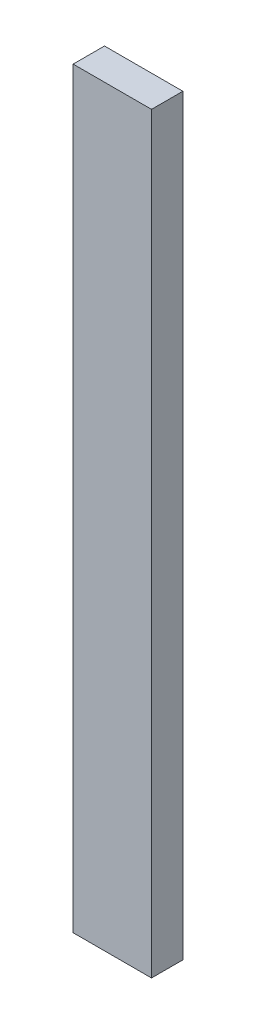
ISO-10303-21;
HEADER;
FILE_DESCRIPTION(('STEP AP214'),'2;1');
FILE_NAME('part.step','',(''),(''),'','','');
FILE_SCHEMA(('AUTOMOTIVE_DESIGN { 1 0 10303 214 1 1 1 1 }'));
ENDSEC;
DATA;
#1=APPLICATION_CONTEXT('core data for automotive mechanical design processes');
#2=APPLICATION_PROTOCOL_DEFINITION('international standard','automotive_design',2000,#1);
#3=PRODUCT_CONTEXT('',#1,'mechanical');
#4=PRODUCT('Part','Part','',(#3));
#5=PRODUCT_RELATED_PRODUCT_CATEGORY('part','',(#4));
#6=PRODUCT_DEFINITION_FORMATION('','',#4);
#7=PRODUCT_DEFINITION_CONTEXT('part definition',#1,'design');
#8=PRODUCT_DEFINITION('design','',#6,#7);
#9=PRODUCT_DEFINITION_SHAPE('','',#8);
#10=(LENGTH_UNIT() NAMED_UNIT(*) SI_UNIT(.MILLI.,.METRE.));
#11=(NAMED_UNIT(*) PLANE_ANGLE_UNIT() SI_UNIT($,.RADIAN.));
#12=(NAMED_UNIT(*) SI_UNIT($,.STERADIAN.) SOLID_ANGLE_UNIT());
#13=UNCERTAINTY_MEASURE_WITH_UNIT(LENGTH_MEASURE(1.E-05),#10,'distance_accuracy_value','');
#14=(GEOMETRIC_REPRESENTATION_CONTEXT(3) GLOBAL_UNCERTAINTY_ASSIGNED_CONTEXT((#13)) GLOBAL_UNIT_ASSIGNED_CONTEXT((#10,
#11,#12)) REPRESENTATION_CONTEXT('',''));
#15=CARTESIAN_POINT('',(0.,0.,0.));
#16=DIRECTION('',(0.,0.,1.));
#17=DIRECTION('',(1.,0.,0.));
#18=AXIS2_PLACEMENT_3D('',#15,#16,#17);
#19=CARTESIAN_POINT('',(-2.75,-1.675,2.18));
#20=DIRECTION('',(0.,0.,1.));
#21=DIRECTION('',(1.,0.,0.));
#22=AXIS2_PLACEMENT_3D('',#19,#20,#21);
#23=PLANE('',#22);
#24=DIRECTION('',(0.,1.,0.));
#25=VECTOR('',#24,1.);
#26=CARTESIAN_POINT('',(-2.875,-2.875,2.18));
#27=LINE('',#26,#25);
#28=CARTESIAN_POINT('',(-2.875,-2.875,2.18));
#29=VERTEX_POINT('',#28);
#30=CARTESIAN_POINT('',(-2.875,-0.475,2.18));
#31=VERTEX_POINT('',#30);
#32=EDGE_CURVE('E28',#29,#31,#27,.T.);
#33=ORIENTED_EDGE('',*,*,#32,.F.);
#34=DIRECTION('',(-1.,0.,0.));
#35=VECTOR('',#34,1.);
#36=CARTESIAN_POINT('',(-2.625,-2.875,2.18));
#37=LINE('',#36,#35);
#38=CARTESIAN_POINT('',(-2.625,-2.875,2.18));
#39=VERTEX_POINT('',#38);
#40=EDGE_CURVE('E98',#39,#29,#37,.T.);
#41=ORIENTED_EDGE('',*,*,#40,.F.);
#42=DIRECTION('',(0.,-1.,0.));
#43=VECTOR('',#42,1.);
#44=CARTESIAN_POINT('',(-2.625,-0.475,2.18));
#45=LINE('',#44,#43);
#46=CARTESIAN_POINT('',(-2.625,-0.475,2.18));
#47=VERTEX_POINT('',#46);
#48=EDGE_CURVE('E71',#47,#39,#45,.T.);
#49=ORIENTED_EDGE('',*,*,#48,.F.);
#50=DIRECTION('',(1.,0.,0.));
#51=VECTOR('',#50,1.);
#52=CARTESIAN_POINT('',(-2.875,-0.475,2.18));
#53=LINE('',#52,#51);
#54=EDGE_CURVE('E84',#31,#47,#53,.T.);
#55=ORIENTED_EDGE('',*,*,#54,.F.);
#56=EDGE_LOOP('',(#33,#41,#49,#55));
#57=FACE_BOUND('',#56,.T.);
#58=ADVANCED_FACE('F17',(#57),#23,.T.);
#59=CARTESIAN_POINT('',(-2.75,-1.675,2.08));
#60=DIRECTION('',(0.,0.,1.));
#61=DIRECTION('',(1.,0.,0.));
#62=AXIS2_PLACEMENT_3D('',#59,#60,#61);
#63=PLANE('',#62);
#64=DIRECTION('',(1.,0.,0.));
#65=VECTOR('',#64,1.);
#66=CARTESIAN_POINT('',(-2.875,-0.475,2.08));
#67=LINE('',#66,#65);
#68=CARTESIAN_POINT('',(-2.875,-0.475,2.08));
#69=VERTEX_POINT('',#68);
#70=CARTESIAN_POINT('',(-2.625,-0.475,2.08));
#71=VERTEX_POINT('',#70);
#72=EDGE_CURVE('E92',#69,#71,#67,.T.);
#73=ORIENTED_EDGE('',*,*,#72,.T.);
#74=DIRECTION('',(0.,-1.,0.));
#75=VECTOR('',#74,1.);
#76=CARTESIAN_POINT('',(-2.625,-0.475,2.08));
#77=LINE('',#76,#75);
#78=CARTESIAN_POINT('',(-2.625,-2.875,2.08));
#79=VERTEX_POINT('',#78);
#80=EDGE_CURVE('E63',#71,#79,#77,.T.);
#81=ORIENTED_EDGE('',*,*,#80,.T.);
#82=DIRECTION('',(-1.,0.,0.));
#83=VECTOR('',#82,1.);
#84=CARTESIAN_POINT('',(-2.625,-2.875,2.08));
#85=LINE('',#84,#83);
#86=CARTESIAN_POINT('',(-2.875,-2.875,2.08));
#87=VERTEX_POINT('',#86);
#88=EDGE_CURVE('E21',#79,#87,#85,.T.);
#89=ORIENTED_EDGE('',*,*,#88,.T.);
#90=DIRECTION('',(0.,1.,0.));
#91=VECTOR('',#90,1.);
#92=CARTESIAN_POINT('',(-2.875,-2.875,2.08));
#93=LINE('',#92,#91);
#94=EDGE_CURVE('E11',#87,#69,#93,.T.);
#95=ORIENTED_EDGE('',*,*,#94,.T.);
#96=EDGE_LOOP('',(#73,#81,#89,#95));
#97=FACE_BOUND('',#96,.T.);
#98=ADVANCED_FACE('F119',(#97),#63,.F.);
#99=CARTESIAN_POINT('',(-2.875,-2.875,2.08));
#100=DIRECTION('',(-1.,0.,0.));
#101=DIRECTION('',(0.,0.,1.));
#102=AXIS2_PLACEMENT_3D('',#99,#100,#101);
#103=PLANE('',#102);
#104=DIRECTION('',(0.,0.,1.));
#105=VECTOR('',#104,1.);
#106=CARTESIAN_POINT('',(-2.875,-2.875,2.08));
#107=LINE('',#106,#105);
#108=EDGE_CURVE('E79',#87,#29,#107,.T.);
#109=ORIENTED_EDGE('',*,*,#108,.T.);
#110=ORIENTED_EDGE('',*,*,#32,.T.);
#111=DIRECTION('',(0.,0.,1.));
#112=VECTOR('',#111,1.);
#113=CARTESIAN_POINT('',(-2.875,-0.475,2.08));
#114=LINE('',#113,#112);
#115=EDGE_CURVE('E77',#69,#31,#114,.T.);
#116=ORIENTED_EDGE('',*,*,#115,.F.);
#117=ORIENTED_EDGE('',*,*,#94,.F.);
#118=EDGE_LOOP('',(#109,#110,#116,#117));
#119=FACE_BOUND('',#118,.T.);
#120=ADVANCED_FACE('F75',(#119),#103,.T.);
#121=CARTESIAN_POINT('',(-2.625,-2.875,2.08));
#122=DIRECTION('',(0.,-1.,0.));
#123=DIRECTION('',(0.,0.,-1.));
#124=AXIS2_PLACEMENT_3D('',#121,#122,#123);
#125=PLANE('',#124);
#126=DIRECTION('',(0.,0.,1.));
#127=VECTOR('',#126,1.);
#128=CARTESIAN_POINT('',(-2.625,-2.875,2.08));
#129=LINE('',#128,#127);
#130=EDGE_CURVE('E99',#79,#39,#129,.T.);
#131=ORIENTED_EDGE('',*,*,#130,.T.);
#132=ORIENTED_EDGE('',*,*,#40,.T.);
#133=ORIENTED_EDGE('',*,*,#108,.F.);
#134=ORIENTED_EDGE('',*,*,#88,.F.);
#135=EDGE_LOOP('',(#131,#132,#133,#134));
#136=FACE_BOUND('',#135,.T.);
#137=ADVANCED_FACE('F19',(#136),#125,.T.);
#138=CARTESIAN_POINT('',(-2.625,-0.475,2.08));
#139=DIRECTION('',(1.,0.,0.));
#140=DIRECTION('',(0.,1.,0.));
#141=AXIS2_PLACEMENT_3D('',#138,#139,#140);
#142=PLANE('',#141);
#143=DIRECTION('',(0.,0.,1.));
#144=VECTOR('',#143,1.);
#145=CARTESIAN_POINT('',(-2.625,-0.475,2.08));
#146=LINE('',#145,#144);
#147=EDGE_CURVE('E88',#71,#47,#146,.T.);
#148=ORIENTED_EDGE('',*,*,#147,.T.);
#149=ORIENTED_EDGE('',*,*,#48,.T.);
#150=ORIENTED_EDGE('',*,*,#130,.F.);
#151=ORIENTED_EDGE('',*,*,#80,.F.);
#152=EDGE_LOOP('',(#148,#149,#150,#151));
#153=FACE_BOUND('',#152,.T.);
#154=ADVANCED_FACE('F114',(#153),#142,.T.);
#155=CARTESIAN_POINT('',(-2.875,-0.475,2.08));
#156=DIRECTION('',(0.,1.,0.));
#157=DIRECTION('',(1.,0.,0.));
#158=AXIS2_PLACEMENT_3D('',#155,#156,#157);
#159=PLANE('',#158);
#160=ORIENTED_EDGE('',*,*,#115,.T.);
#161=ORIENTED_EDGE('',*,*,#54,.T.);
#162=ORIENTED_EDGE('',*,*,#147,.F.);
#163=ORIENTED_EDGE('',*,*,#72,.F.);
#164=EDGE_LOOP('',(#160,#161,#162,#163));
#165=FACE_BOUND('',#164,.T.);
#166=ADVANCED_FACE('F91',(#165),#159,.T.);
#167=CLOSED_SHELL('',(#58,#98,#120,#137,#154,#166));
#168=MANIFOLD_SOLID_BREP('B1',#167);
#169=ADVANCED_BREP_SHAPE_REPRESENTATION('',(#18,#168),#14);
#170=SHAPE_DEFINITION_REPRESENTATION(#9,#169);
ENDSEC;
END-ISO-10303-21;
